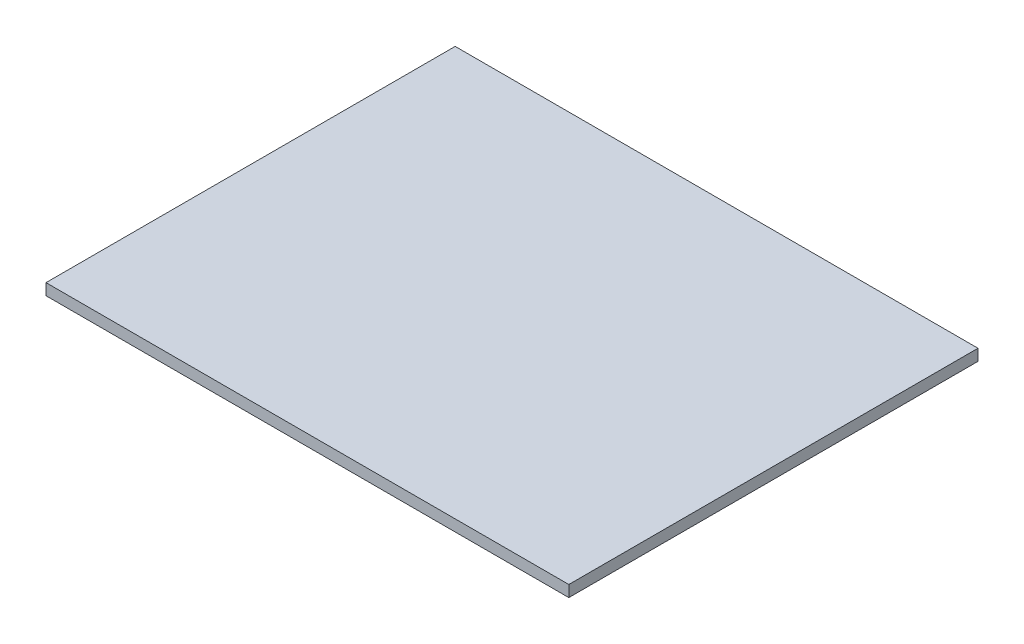
ISO-10303-21;
HEADER;
FILE_DESCRIPTION(('STEP AP214'),'2;1');
FILE_NAME('part.step','',(''),(''),'','','');
FILE_SCHEMA(('AUTOMOTIVE_DESIGN { 1 0 10303 214 1 1 1 1 }'));
ENDSEC;
DATA;
#1=APPLICATION_CONTEXT('core data for automotive mechanical design processes');
#2=APPLICATION_PROTOCOL_DEFINITION('international standard','automotive_design',2000,#1);
#3=PRODUCT_CONTEXT('',#1,'mechanical');
#4=PRODUCT('Part','Part','',(#3));
#5=PRODUCT_RELATED_PRODUCT_CATEGORY('part','',(#4));
#6=PRODUCT_DEFINITION_FORMATION('','',#4);
#7=PRODUCT_DEFINITION_CONTEXT('part definition',#1,'design');
#8=PRODUCT_DEFINITION('design','',#6,#7);
#9=PRODUCT_DEFINITION_SHAPE('','',#8);
#10=(LENGTH_UNIT() NAMED_UNIT(*) SI_UNIT(.MILLI.,.METRE.));
#11=(NAMED_UNIT(*) PLANE_ANGLE_UNIT() SI_UNIT($,.RADIAN.));
#12=(NAMED_UNIT(*) SI_UNIT($,.STERADIAN.) SOLID_ANGLE_UNIT());
#13=UNCERTAINTY_MEASURE_WITH_UNIT(LENGTH_MEASURE(1.E-05),#10,'distance_accuracy_value','');
#14=(GEOMETRIC_REPRESENTATION_CONTEXT(3) GLOBAL_UNCERTAINTY_ASSIGNED_CONTEXT((#13)) GLOBAL_UNIT_ASSIGNED_CONTEXT((#10,
#11,#12)) REPRESENTATION_CONTEXT('',''));
#15=CARTESIAN_POINT('',(0.,0.,0.));
#16=DIRECTION('',(0.,0.,1.));
#17=DIRECTION('',(1.,0.,0.));
#18=AXIS2_PLACEMENT_3D('',#15,#16,#17);
#19=CARTESIAN_POINT('',(-292.1,12.7,457.2));
#20=DIRECTION('',(1.,0.,0.));
#21=DIRECTION('',(0.,0.,-1.));
#22=AXIS2_PLACEMENT_3D('',#19,#20,#21);
#23=PLANE('',#22);
#24=DIRECTION('',(0.,0.,1.));
#25=VECTOR('',#24,1.);
#26=CARTESIAN_POINT('',(-292.1,0.,457.2));
#27=LINE('',#26,#25);
#28=CARTESIAN_POINT('',(-292.1,0.,0.));
#29=VERTEX_POINT('',#28);
#30=CARTESIAN_POINT('',(-292.1,0.,457.2));
#31=VERTEX_POINT('',#30);
#32=EDGE_CURVE('E96',#29,#31,#27,.T.);
#33=ORIENTED_EDGE('',*,*,#32,.T.);
#34=DIRECTION('',(0.,-1.,0.));
#35=VECTOR('',#34,1.);
#36=CARTESIAN_POINT('',(-292.1,12.7,457.2));
#37=LINE('',#36,#35);
#38=CARTESIAN_POINT('',(-292.1,12.7,457.2));
#39=VERTEX_POINT('',#38);
#40=EDGE_CURVE('E11',#39,#31,#37,.T.);
#41=ORIENTED_EDGE('',*,*,#40,.F.);
#42=DIRECTION('',(0.,0.,1.));
#43=VECTOR('',#42,1.);
#44=CARTESIAN_POINT('',(-292.1,12.7,457.2));
#45=LINE('',#44,#43);
#46=CARTESIAN_POINT('',(-292.1,12.7,0.));
#47=VERTEX_POINT('',#46);
#48=EDGE_CURVE('E84',#47,#39,#45,.T.);
#49=ORIENTED_EDGE('',*,*,#48,.F.);
#50=DIRECTION('',(0.,-1.,0.));
#51=VECTOR('',#50,1.);
#52=CARTESIAN_POINT('',(-292.1,12.7,0.));
#53=LINE('',#52,#51);
#54=EDGE_CURVE('E92',#47,#29,#53,.T.);
#55=ORIENTED_EDGE('',*,*,#54,.T.);
#56=EDGE_LOOP('',(#33,#41,#49,#55));
#57=FACE_BOUND('',#56,.T.);
#58=ADVANCED_FACE('F33',(#57),#23,.F.);
#59=CARTESIAN_POINT('',(292.1,12.7,457.2));
#60=DIRECTION('',(0.,0.,-1.));
#61=DIRECTION('',(-1.,0.,0.));
#62=AXIS2_PLACEMENT_3D('',#59,#60,#61);
#63=PLANE('',#62);
#64=DIRECTION('',(1.,0.,0.));
#65=VECTOR('',#64,1.);
#66=CARTESIAN_POINT('',(292.1,0.,457.2));
#67=LINE('',#66,#65);
#68=CARTESIAN_POINT('',(292.1,0.,457.2));
#69=VERTEX_POINT('',#68);
#70=EDGE_CURVE('E88',#31,#69,#67,.T.);
#71=ORIENTED_EDGE('',*,*,#70,.T.);
#72=DIRECTION('',(0.,-1.,0.));
#73=VECTOR('',#72,1.);
#74=CARTESIAN_POINT('',(292.1,12.7,457.2));
#75=LINE('',#74,#73);
#76=CARTESIAN_POINT('',(292.1,12.7,457.2));
#77=VERTEX_POINT('',#76);
#78=EDGE_CURVE('E41',#77,#69,#75,.T.);
#79=ORIENTED_EDGE('',*,*,#78,.F.);
#80=DIRECTION('',(1.,0.,0.));
#81=VECTOR('',#80,1.);
#82=CARTESIAN_POINT('',(292.1,12.7,457.2));
#83=LINE('',#82,#81);
#84=EDGE_CURVE('E79',#39,#77,#83,.T.);
#85=ORIENTED_EDGE('',*,*,#84,.F.);
#86=ORIENTED_EDGE('',*,*,#40,.T.);
#87=EDGE_LOOP('',(#71,#79,#85,#86));
#88=FACE_BOUND('',#87,.T.);
#89=ADVANCED_FACE('F87',(#88),#63,.F.);
#90=CARTESIAN_POINT('',(292.1,12.7,457.2));
#91=DIRECTION('',(-1.,0.,0.));
#92=DIRECTION('',(0.,0.,1.));
#93=AXIS2_PLACEMENT_3D('',#90,#91,#92);
#94=PLANE('',#93);
#95=DIRECTION('',(0.,0.,-1.));
#96=VECTOR('',#95,1.);
#97=CARTESIAN_POINT('',(292.1,0.,457.2));
#98=LINE('',#97,#96);
#99=CARTESIAN_POINT('',(292.1,0.,0.));
#100=VERTEX_POINT('',#99);
#101=EDGE_CURVE('E66',#69,#100,#98,.T.);
#102=ORIENTED_EDGE('',*,*,#101,.T.);
#103=DIRECTION('',(0.,-1.,0.));
#104=VECTOR('',#103,1.);
#105=CARTESIAN_POINT('',(292.1,12.7,0.));
#106=LINE('',#105,#104);
#107=CARTESIAN_POINT('',(292.1,12.7,0.));
#108=VERTEX_POINT('',#107);
#109=EDGE_CURVE('E89',#108,#100,#106,.T.);
#110=ORIENTED_EDGE('',*,*,#109,.F.);
#111=DIRECTION('',(0.,0.,-1.));
#112=VECTOR('',#111,1.);
#113=CARTESIAN_POINT('',(292.1,12.7,457.2));
#114=LINE('',#113,#112);
#115=EDGE_CURVE('E82',#77,#108,#114,.T.);
#116=ORIENTED_EDGE('',*,*,#115,.F.);
#117=ORIENTED_EDGE('',*,*,#78,.T.);
#118=EDGE_LOOP('',(#102,#110,#116,#117));
#119=FACE_BOUND('',#118,.T.);
#120=ADVANCED_FACE('F90',(#119),#94,.F.);
#121=CARTESIAN_POINT('',(292.1,12.7,0.));
#122=DIRECTION('',(0.,0.,1.));
#123=DIRECTION('',(1.,0.,0.));
#124=AXIS2_PLACEMENT_3D('',#121,#122,#123);
#125=PLANE('',#124);
#126=DIRECTION('',(-1.,0.,0.));
#127=VECTOR('',#126,1.);
#128=CARTESIAN_POINT('',(292.1,0.,0.));
#129=LINE('',#128,#127);
#130=EDGE_CURVE('E72',#100,#29,#129,.T.);
#131=ORIENTED_EDGE('',*,*,#130,.T.);
#132=ORIENTED_EDGE('',*,*,#54,.F.);
#133=DIRECTION('',(-1.,0.,0.));
#134=VECTOR('',#133,1.);
#135=CARTESIAN_POINT('',(292.1,12.7,0.));
#136=LINE('',#135,#134);
#137=EDGE_CURVE('E49',#108,#47,#136,.T.);
#138=ORIENTED_EDGE('',*,*,#137,.F.);
#139=ORIENTED_EDGE('',*,*,#109,.T.);
#140=EDGE_LOOP('',(#131,#132,#138,#139));
#141=FACE_BOUND('',#140,.T.);
#142=ADVANCED_FACE('F103',(#141),#125,.F.);
#143=CARTESIAN_POINT('',(0.,12.7,0.));
#144=DIRECTION('',(0.,1.,0.));
#145=DIRECTION('',(0.,0.,1.));
#146=AXIS2_PLACEMENT_3D('',#143,#144,#145);
#147=PLANE('',#146);
#148=ORIENTED_EDGE('',*,*,#48,.T.);
#149=ORIENTED_EDGE('',*,*,#84,.T.);
#150=ORIENTED_EDGE('',*,*,#115,.T.);
#151=ORIENTED_EDGE('',*,*,#137,.T.);
#152=EDGE_LOOP('',(#148,#149,#150,#151));
#153=FACE_BOUND('',#152,.T.);
#154=ADVANCED_FACE('F80',(#153),#147,.T.);
#155=CARTESIAN_POINT('',(0.,0.,0.));
#156=DIRECTION('',(0.,1.,0.));
#157=DIRECTION('',(0.,0.,1.));
#158=AXIS2_PLACEMENT_3D('',#155,#156,#157);
#159=PLANE('',#158);
#160=ORIENTED_EDGE('',*,*,#32,.F.);
#161=ORIENTED_EDGE('',*,*,#130,.F.);
#162=ORIENTED_EDGE('',*,*,#101,.F.);
#163=ORIENTED_EDGE('',*,*,#70,.F.);
#164=EDGE_LOOP('',(#160,#161,#162,#163));
#165=FACE_BOUND('',#164,.T.);
#166=ADVANCED_FACE('F106',(#165),#159,.F.);
#167=CLOSED_SHELL('',(#58,#89,#120,#142,#154,#166));
#168=MANIFOLD_SOLID_BREP('B2',#167);
#169=ADVANCED_BREP_SHAPE_REPRESENTATION('',(#18,#168),#14);
#170=SHAPE_DEFINITION_REPRESENTATION(#9,#169);
ENDSEC;
END-ISO-10303-21;
